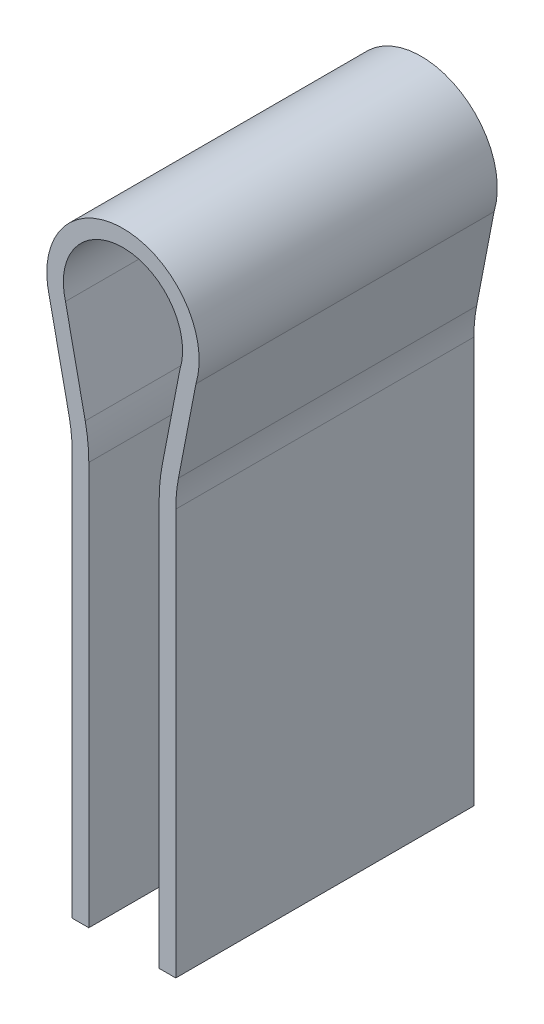
ISO-10303-21;
HEADER;
FILE_DESCRIPTION(('STEP AP214'),'2;1');
FILE_NAME('part.step','',(''),(''),'','','');
FILE_SCHEMA(('AUTOMOTIVE_DESIGN { 1 0 10303 214 1 1 1 1 }'));
ENDSEC;
DATA;
#1=APPLICATION_CONTEXT('core data for automotive mechanical design processes');
#2=APPLICATION_PROTOCOL_DEFINITION('international standard','automotive_design',2000,#1);
#3=PRODUCT_CONTEXT('',#1,'mechanical');
#4=PRODUCT('Part','Part','',(#3));
#5=PRODUCT_RELATED_PRODUCT_CATEGORY('part','',(#4));
#6=PRODUCT_DEFINITION_FORMATION('','',#4);
#7=PRODUCT_DEFINITION_CONTEXT('part definition',#1,'design');
#8=PRODUCT_DEFINITION('design','',#6,#7);
#9=PRODUCT_DEFINITION_SHAPE('','',#8);
#10=(LENGTH_UNIT() NAMED_UNIT(*) SI_UNIT(.MILLI.,.METRE.));
#11=(NAMED_UNIT(*) PLANE_ANGLE_UNIT() SI_UNIT($,.RADIAN.));
#12=(NAMED_UNIT(*) SI_UNIT($,.STERADIAN.) SOLID_ANGLE_UNIT());
#13=UNCERTAINTY_MEASURE_WITH_UNIT(LENGTH_MEASURE(1.E-05),#10,'distance_accuracy_value','');
#14=(GEOMETRIC_REPRESENTATION_CONTEXT(3) GLOBAL_UNCERTAINTY_ASSIGNED_CONTEXT((#13)) GLOBAL_UNIT_ASSIGNED_CONTEXT((#10,
#11,#12)) REPRESENTATION_CONTEXT('',''));
#15=CARTESIAN_POINT('',(0.,0.,0.));
#16=DIRECTION('',(0.,0.,1.));
#17=DIRECTION('',(1.,0.,0.));
#18=AXIS2_PLACEMENT_3D('',#15,#16,#17);
#19=CARTESIAN_POINT('',(4.25,0.,18.));
#20=DIRECTION('',(0.,1.,0.));
#21=DIRECTION('',(0.,0.,1.));
#22=AXIS2_PLACEMENT_3D('',#19,#20,#21);
#23=PLANE('',#22);
#24=DIRECTION('',(1.,0.,0.));
#25=VECTOR('',#24,1.);
#26=CARTESIAN_POINT('',(4.25,0.,0.));
#27=LINE('',#26,#25);
#28=CARTESIAN_POINT('',(4.25,0.,0.));
#29=VERTEX_POINT('',#28);
#30=CARTESIAN_POINT('',(5.25,0.,0.));
#31=VERTEX_POINT('',#30);
#32=EDGE_CURVE('E177',#29,#31,#27,.T.);
#33=ORIENTED_EDGE('',*,*,#32,.T.);
#34=DIRECTION('',(0.,0.,-1.));
#35=VECTOR('',#34,1.);
#36=CARTESIAN_POINT('',(5.25,0.,18.));
#37=LINE('',#36,#35);
#38=CARTESIAN_POINT('',(5.25,0.,18.));
#39=VERTEX_POINT('',#38);
#40=EDGE_CURVE('E11',#39,#31,#37,.T.);
#41=ORIENTED_EDGE('',*,*,#40,.F.);
#42=DIRECTION('',(1.,0.,0.));
#43=VECTOR('',#42,1.);
#44=CARTESIAN_POINT('',(4.25,0.,18.));
#45=LINE('',#44,#43);
#46=CARTESIAN_POINT('',(4.25,0.,18.));
#47=VERTEX_POINT('',#46);
#48=EDGE_CURVE('E215',#47,#39,#45,.T.);
#49=ORIENTED_EDGE('',*,*,#48,.F.);
#50=DIRECTION('',(0.,0.,-1.));
#51=VECTOR('',#50,1.);
#52=CARTESIAN_POINT('',(4.25,0.,18.));
#53=LINE('',#52,#51);
#54=EDGE_CURVE('E49',#47,#29,#53,.T.);
#55=ORIENTED_EDGE('',*,*,#54,.T.);
#56=EDGE_LOOP('',(#33,#41,#49,#55));
#57=FACE_BOUND('',#56,.T.);
#58=ADVANCED_FACE('F33',(#57),#23,.F.);
#59=CARTESIAN_POINT('',(5.25,0.,18.));
#60=DIRECTION('',(-1.,0.,0.));
#61=DIRECTION('',(0.,-1.,0.));
#62=AXIS2_PLACEMENT_3D('',#59,#60,#61);
#63=PLANE('',#62);
#64=DIRECTION('',(0.,1.,0.));
#65=VECTOR('',#64,1.);
#66=CARTESIAN_POINT('',(5.25,0.,0.));
#67=LINE('',#66,#65);
#68=CARTESIAN_POINT('',(5.25,24.5111845914989,0.));
#69=VERTEX_POINT('',#68);
#70=EDGE_CURVE('E179',#31,#69,#67,.T.);
#71=ORIENTED_EDGE('',*,*,#70,.T.);
#72=DIRECTION('',(0.,0.,-1.));
#73=VECTOR('',#72,1.);
#74=CARTESIAN_POINT('',(5.25,24.5111845914989,18.));
#75=LINE('',#74,#73);
#76=CARTESIAN_POINT('',(5.25,24.5111845914989,18.));
#77=VERTEX_POINT('',#76);
#78=EDGE_CURVE('E41',#77,#69,#75,.T.);
#79=ORIENTED_EDGE('',*,*,#78,.F.);
#80=DIRECTION('',(0.,1.,0.));
#81=VECTOR('',#80,1.);
#82=CARTESIAN_POINT('',(5.25,0.,18.));
#83=LINE('',#82,#81);
#84=EDGE_CURVE('E111',#39,#77,#83,.T.);
#85=ORIENTED_EDGE('',*,*,#84,.F.);
#86=ORIENTED_EDGE('',*,*,#40,.T.);
#87=EDGE_LOOP('',(#71,#79,#85,#86));
#88=FACE_BOUND('',#87,.T.);
#89=ADVANCED_FACE('F301',(#88),#63,.F.);
#90=CARTESIAN_POINT('',(14.25,24.5111845914989,18.));
#91=DIRECTION('',(0.,0.,-1.));
#92=DIRECTION('',(-1.,0.,0.));
#93=AXIS2_PLACEMENT_3D('',#90,#91,#92);
#94=CYLINDRICAL_SURFACE('',#93,9.);
#95=CARTESIAN_POINT('',(14.25,24.5111845914989,0.));
#96=DIRECTION('',(0.,0.,-1.));
#97=DIRECTION('',(-1.,0.,0.));
#98=AXIS2_PLACEMENT_3D('',#95,#96,#97);
#99=CIRCLE('',#98,9.);
#100=CARTESIAN_POINT('',(5.41343086698722,26.2185351581622,0.));
#101=VERTEX_POINT('',#100);
#102=EDGE_CURVE('E181',#69,#101,#99,.T.);
#103=ORIENTED_EDGE('',*,*,#102,.T.);
#104=DIRECTION('',(0.,0.,-1.));
#105=VECTOR('',#104,1.);
#106=CARTESIAN_POINT('',(5.41343086698722,26.2185351581622,18.));
#107=LINE('',#106,#105);
#108=CARTESIAN_POINT('',(5.41343086698722,26.2185351581622,18.));
#109=VERTEX_POINT('',#108);
#110=EDGE_CURVE('E241',#109,#101,#107,.T.);
#111=ORIENTED_EDGE('',*,*,#110,.F.);
#112=CARTESIAN_POINT('',(14.25,24.5111845914989,18.));
#113=DIRECTION('',(0.,0.,-1.));
#114=DIRECTION('',(-1.,0.,0.));
#115=AXIS2_PLACEMENT_3D('',#112,#113,#114);
#116=CIRCLE('',#115,9.);
#117=EDGE_CURVE('E249',#77,#109,#116,.T.);
#118=ORIENTED_EDGE('',*,*,#117,.F.);
#119=ORIENTED_EDGE('',*,*,#78,.T.);
#120=EDGE_LOOP('',(#103,#111,#118,#119));
#121=FACE_BOUND('',#120,.T.);
#122=ADVANCED_FACE('F247',(#121),#94,.F.);
#123=CARTESIAN_POINT('',(5.41343086698722,26.2185351581622,18.));
#124=DIRECTION('',(-0.981841014779198,0.18970561851815,0.));
#125=DIRECTION('',(-0.18970561851815,-0.981841014779199,0.));
#126=AXIS2_PLACEMENT_3D('',#123,#124,#125);
#127=PLANE('',#126);
#128=DIRECTION('',(0.18970561851815,0.981841014779198,0.));
#129=VECTOR('',#128,1.);
#130=CARTESIAN_POINT('',(5.41343086698722,26.2185351581622,0.));
#131=LINE('',#130,#129);
#132=CARTESIAN_POINT('',(6.4674462510982,31.6737006003465,0.));
#133=VERTEX_POINT('',#132);
#134=EDGE_CURVE('E183',#101,#133,#131,.T.);
#135=ORIENTED_EDGE('',*,*,#134,.T.);
#136=DIRECTION('',(0.,0.,-1.));
#137=VECTOR('',#136,1.);
#138=CARTESIAN_POINT('',(6.4674462510982,31.6737006003465,18.));
#139=LINE('',#138,#137);
#140=CARTESIAN_POINT('',(6.4674462510982,31.6737006003465,18.));
#141=VERTEX_POINT('',#140);
#142=EDGE_CURVE('E238',#141,#133,#139,.T.);
#143=ORIENTED_EDGE('',*,*,#142,.F.);
#144=DIRECTION('',(0.18970561851815,0.981841014779198,0.));
#145=VECTOR('',#144,1.);
#146=CARTESIAN_POINT('',(5.41343086698722,26.2185351581622,18.));
#147=LINE('',#146,#145);
#148=EDGE_CURVE('E266',#109,#141,#147,.T.);
#149=ORIENTED_EDGE('',*,*,#148,.F.);
#150=ORIENTED_EDGE('',*,*,#110,.T.);
#151=EDGE_LOOP('',(#135,#143,#149,#150));
#152=FACE_BOUND('',#151,.T.);
#153=ADVANCED_FACE('F256',(#152),#127,.F.);
#154=CARTESIAN_POINT('',(2.06276203879621,32.9998819566842,18.));
#155=DIRECTION('',(0.,0.,-1.));
#156=DIRECTION('',(-1.,0.,0.));
#157=AXIS2_PLACEMENT_3D('',#154,#155,#156);
#158=CYLINDRICAL_SURFACE('',#157,4.6);
#159=CARTESIAN_POINT('',(2.06276203879621,32.9998819566842,0.));
#160=DIRECTION('',(0.,0.,1.));
#161=DIRECTION('',(1.,0.,0.));
#162=AXIS2_PLACEMENT_3D('',#159,#160,#161);
#163=CIRCLE('',#162,4.6);
#164=CARTESIAN_POINT('',(-2.37978702323856,31.8066687186525,0.));
#165=VERTEX_POINT('',#164);
#166=EDGE_CURVE('E185',#133,#165,#163,.T.);
#167=ORIENTED_EDGE('',*,*,#166,.T.);
#168=DIRECTION('',(0.,0.,-1.));
#169=VECTOR('',#168,1.);
#170=CARTESIAN_POINT('',(-2.37978702323856,31.8066687186525,18.));
#171=LINE('',#170,#169);
#172=CARTESIAN_POINT('',(-2.37978702323856,31.8066687186525,18.));
#173=VERTEX_POINT('',#172);
#174=EDGE_CURVE('E236',#173,#165,#171,.T.);
#175=ORIENTED_EDGE('',*,*,#174,.F.);
#176=CARTESIAN_POINT('',(2.06276203879621,32.9998819566842,18.));
#177=DIRECTION('',(0.,0.,1.));
#178=DIRECTION('',(1.,0.,0.));
#179=AXIS2_PLACEMENT_3D('',#176,#177,#178);
#180=CIRCLE('',#179,4.6);
#181=EDGE_CURVE('E262',#141,#173,#180,.T.);
#182=ORIENTED_EDGE('',*,*,#181,.F.);
#183=ORIENTED_EDGE('',*,*,#142,.T.);
#184=EDGE_LOOP('',(#167,#175,#182,#183));
#185=FACE_BOUND('',#184,.T.);
#186=ADVANCED_FACE('F260',(#185),#158,.T.);
#187=CARTESIAN_POINT('',(-1.1940246046762,26.1888999245992,18.));
#188=DIRECTION('',(-0.978441710591533,-0.206523168130637,0.));
#189=DIRECTION('',(0.206523168130637,-0.978441710591533,0.));
#190=AXIS2_PLACEMENT_3D('',#187,#188,#189);
#191=PLANE('',#190);
#192=DIRECTION('',(-0.206523168130637,0.978441710591533,0.));
#193=VECTOR('',#192,1.);
#194=CARTESIAN_POINT('',(-1.1940246046762,26.1888999245992,0.));
#195=LINE('',#194,#193);
#196=CARTESIAN_POINT('',(-1.1940246046762,26.1888999245992,0.));
#197=VERTEX_POINT('',#196);
#198=EDGE_CURVE('E188',#197,#165,#195,.T.);
#199=ORIENTED_EDGE('',*,*,#198,.F.);
#200=DIRECTION('',(0.,0.,-1.));
#201=VECTOR('',#200,1.);
#202=CARTESIAN_POINT('',(-1.1940246046762,26.1888999245992,18.));
#203=LINE('',#202,#201);
#204=CARTESIAN_POINT('',(-1.1940246046762,26.1888999245992,18.));
#205=VERTEX_POINT('',#204);
#206=EDGE_CURVE('E234',#205,#197,#203,.T.);
#207=ORIENTED_EDGE('',*,*,#206,.F.);
#208=DIRECTION('',(-0.206523168130637,0.978441710591533,0.));
#209=VECTOR('',#208,1.);
#210=CARTESIAN_POINT('',(-1.1940246046762,26.1888999245992,18.));
#211=LINE('',#210,#209);
#212=EDGE_CURVE('E265',#205,#173,#211,.T.);
#213=ORIENTED_EDGE('',*,*,#212,.T.);
#214=ORIENTED_EDGE('',*,*,#174,.T.);
#215=EDGE_LOOP('',(#199,#207,#213,#214));
#216=FACE_BOUND('',#215,.T.);
#217=ADVANCED_FACE('F317',(#216),#191,.T.);
#218=CARTESIAN_POINT('',(-10.,24.3301914114235,18.));
#219=DIRECTION('',(0.,0.,-1.));
#220=DIRECTION('',(-1.,0.,0.));
#221=AXIS2_PLACEMENT_3D('',#218,#219,#220);
#222=CYLINDRICAL_SURFACE('',#221,9.);
#223=CARTESIAN_POINT('',(-10.,24.3301914114235,0.));
#224=DIRECTION('',(0.,0.,1.));
#225=DIRECTION('',(1.,0.,0.));
#226=AXIS2_PLACEMENT_3D('',#223,#224,#225);
#227=CIRCLE('',#226,9.);
#228=CARTESIAN_POINT('',(-1.,24.3301914114235,0.));
#229=VERTEX_POINT('',#228);
#230=EDGE_CURVE('E191',#229,#197,#227,.T.);
#231=ORIENTED_EDGE('',*,*,#230,.F.);
#232=DIRECTION('',(0.,0.,-1.));
#233=VECTOR('',#232,1.);
#234=CARTESIAN_POINT('',(-1.,24.3301914114235,18.));
#235=LINE('',#234,#233);
#236=CARTESIAN_POINT('',(-1.,24.3301914114235,18.));
#237=VERTEX_POINT('',#236);
#238=EDGE_CURVE('E232',#237,#229,#235,.T.);
#239=ORIENTED_EDGE('',*,*,#238,.F.);
#240=CARTESIAN_POINT('',(-10.,24.3301914114235,18.));
#241=DIRECTION('',(0.,0.,1.));
#242=DIRECTION('',(1.,0.,0.));
#243=AXIS2_PLACEMENT_3D('',#240,#241,#242);
#244=CIRCLE('',#243,9.);
#245=EDGE_CURVE('E268',#237,#205,#244,.T.);
#246=ORIENTED_EDGE('',*,*,#245,.T.);
#247=ORIENTED_EDGE('',*,*,#206,.T.);
#248=EDGE_LOOP('',(#231,#239,#246,#247));
#249=FACE_BOUND('',#248,.T.);
#250=ADVANCED_FACE('F320',(#249),#222,.F.);
#251=CARTESIAN_POINT('',(-1.,0.,18.));
#252=DIRECTION('',(-1.,0.,0.));
#253=DIRECTION('',(0.,0.,1.));
#254=AXIS2_PLACEMENT_3D('',#251,#252,#253);
#255=PLANE('',#254);
#256=DIRECTION('',(0.,1.,0.));
#257=VECTOR('',#256,1.);
#258=CARTESIAN_POINT('',(-1.,0.,0.));
#259=LINE('',#258,#257);
#260=CARTESIAN_POINT('',(-1.,0.,0.));
#261=VERTEX_POINT('',#260);
#262=EDGE_CURVE('E194',#261,#229,#259,.T.);
#263=ORIENTED_EDGE('',*,*,#262,.F.);
#264=DIRECTION('',(0.,0.,-1.));
#265=VECTOR('',#264,1.);
#266=CARTESIAN_POINT('',(-1.,0.,18.));
#267=LINE('',#266,#265);
#268=CARTESIAN_POINT('',(-1.,0.,18.));
#269=VERTEX_POINT('',#268);
#270=EDGE_CURVE('E230',#269,#261,#267,.T.);
#271=ORIENTED_EDGE('',*,*,#270,.F.);
#272=DIRECTION('',(0.,1.,0.));
#273=VECTOR('',#272,1.);
#274=CARTESIAN_POINT('',(-1.,0.,18.));
#275=LINE('',#274,#273);
#276=EDGE_CURVE('E275',#269,#237,#275,.T.);
#277=ORIENTED_EDGE('',*,*,#276,.T.);
#278=ORIENTED_EDGE('',*,*,#238,.T.);
#279=EDGE_LOOP('',(#263,#271,#277,#278));
#280=FACE_BOUND('',#279,.T.);
#281=ADVANCED_FACE('F324',(#280),#255,.T.);
#282=CARTESIAN_POINT('',(-1.,0.,18.));
#283=DIRECTION('',(0.,1.,0.));
#284=DIRECTION('',(0.,0.,1.));
#285=AXIS2_PLACEMENT_3D('',#282,#283,#284);
#286=PLANE('',#285);
#287=DIRECTION('',(1.,0.,0.));
#288=VECTOR('',#287,1.);
#289=CARTESIAN_POINT('',(-1.,0.,0.));
#290=LINE('',#289,#288);
#291=CARTESIAN_POINT('',(0.,0.,0.));
#292=VERTEX_POINT('',#291);
#293=EDGE_CURVE('E197',#261,#292,#290,.T.);
#294=ORIENTED_EDGE('',*,*,#293,.T.);
#295=DIRECTION('',(0.,0.,-1.));
#296=VECTOR('',#295,1.);
#297=CARTESIAN_POINT('',(0.,0.,18.));
#298=LINE('',#297,#296);
#299=CARTESIAN_POINT('',(0.,0.,18.));
#300=VERTEX_POINT('',#299);
#301=EDGE_CURVE('E227',#300,#292,#298,.T.);
#302=ORIENTED_EDGE('',*,*,#301,.F.);
#303=DIRECTION('',(1.,0.,0.));
#304=VECTOR('',#303,1.);
#305=CARTESIAN_POINT('',(-1.,0.,18.));
#306=LINE('',#305,#304);
#307=EDGE_CURVE('E278',#269,#300,#306,.T.);
#308=ORIENTED_EDGE('',*,*,#307,.F.);
#309=ORIENTED_EDGE('',*,*,#270,.T.);
#310=EDGE_LOOP('',(#294,#302,#308,#309));
#311=FACE_BOUND('',#310,.T.);
#312=ADVANCED_FACE('F328',(#311),#286,.F.);
#313=CARTESIAN_POINT('',(0.,0.,18.));
#314=DIRECTION('',(-1.,0.,0.));
#315=DIRECTION('',(0.,0.,1.));
#316=AXIS2_PLACEMENT_3D('',#313,#314,#315);
#317=PLANE('',#316);
#318=DIRECTION('',(0.,1.,0.));
#319=VECTOR('',#318,1.);
#320=CARTESIAN_POINT('',(0.,0.,0.));
#321=LINE('',#320,#319);
#322=CARTESIAN_POINT('',(0.,24.3301914114235,0.));
#323=VERTEX_POINT('',#322);
#324=EDGE_CURVE('E199',#292,#323,#321,.T.);
#325=ORIENTED_EDGE('',*,*,#324,.T.);
#326=DIRECTION('',(0.,0.,-1.));
#327=VECTOR('',#326,1.);
#328=CARTESIAN_POINT('',(0.,24.3301914114235,18.));
#329=LINE('',#328,#327);
#330=CARTESIAN_POINT('',(0.,24.3301914114235,18.));
#331=VERTEX_POINT('',#330);
#332=EDGE_CURVE('E224',#331,#323,#329,.T.);
#333=ORIENTED_EDGE('',*,*,#332,.F.);
#334=DIRECTION('',(0.,1.,0.));
#335=VECTOR('',#334,1.);
#336=CARTESIAN_POINT('',(0.,0.,18.));
#337=LINE('',#336,#335);
#338=EDGE_CURVE('E280',#300,#331,#337,.T.);
#339=ORIENTED_EDGE('',*,*,#338,.F.);
#340=ORIENTED_EDGE('',*,*,#301,.T.);
#341=EDGE_LOOP('',(#325,#333,#339,#340));
#342=FACE_BOUND('',#341,.T.);
#343=ADVANCED_FACE('F332',(#342),#317,.F.);
#344=CARTESIAN_POINT('',(-10.,24.3301914114235,18.));
#345=DIRECTION('',(0.,0.,-1.));
#346=DIRECTION('',(-1.,0.,0.));
#347=AXIS2_PLACEMENT_3D('',#344,#345,#346);
#348=CYLINDRICAL_SURFACE('',#347,10.);
#349=CARTESIAN_POINT('',(-10.,24.3301914114235,0.));
#350=DIRECTION('',(0.,0.,1.));
#351=DIRECTION('',(1.,0.,0.));
#352=AXIS2_PLACEMENT_3D('',#349,#350,#351);
#353=CIRCLE('',#352,10.);
#354=CARTESIAN_POINT('',(-0.215582894084672,26.3954230927299,0.));
#355=VERTEX_POINT('',#354);
#356=EDGE_CURVE('E201',#323,#355,#353,.T.);
#357=ORIENTED_EDGE('',*,*,#356,.T.);
#358=DIRECTION('',(0.,0.,-1.));
#359=VECTOR('',#358,1.);
#360=CARTESIAN_POINT('',(-0.215582894084672,26.3954230927299,18.));
#361=LINE('',#360,#359);
#362=CARTESIAN_POINT('',(-0.215582894084672,26.3954230927299,18.));
#363=VERTEX_POINT('',#362);
#364=EDGE_CURVE('E221',#363,#355,#361,.T.);
#365=ORIENTED_EDGE('',*,*,#364,.F.);
#366=CARTESIAN_POINT('',(-10.,24.3301914114235,18.));
#367=DIRECTION('',(0.,0.,1.));
#368=DIRECTION('',(1.,0.,0.));
#369=AXIS2_PLACEMENT_3D('',#366,#367,#368);
#370=CIRCLE('',#369,10.);
#371=EDGE_CURVE('E282',#331,#363,#370,.T.);
#372=ORIENTED_EDGE('',*,*,#371,.F.);
#373=ORIENTED_EDGE('',*,*,#332,.T.);
#374=EDGE_LOOP('',(#357,#365,#372,#373));
#375=FACE_BOUND('',#374,.T.);
#376=ADVANCED_FACE('F336',(#375),#348,.T.);
#377=CARTESIAN_POINT('',(-0.215582894084672,26.3954230927299,18.));
#378=DIRECTION('',(-0.978441710591533,-0.206523168130636,0.));
#379=DIRECTION('',(0.206523168130636,-0.978441710591533,0.));
#380=AXIS2_PLACEMENT_3D('',#377,#378,#379);
#381=PLANE('',#380);
#382=DIRECTION('',(-0.206523168130636,0.978441710591533,0.));
#383=VECTOR('',#382,1.);
#384=CARTESIAN_POINT('',(-0.215582894084672,26.3954230927299,0.));
#385=LINE('',#384,#383);
#386=CARTESIAN_POINT('',(-1.40730553343082,32.0414295352368,0.));
#387=VERTEX_POINT('',#386);
#388=EDGE_CURVE('E203',#355,#387,#385,.T.);
#389=ORIENTED_EDGE('',*,*,#388,.T.);
#390=DIRECTION('',(0.,0.,-1.));
#391=VECTOR('',#390,1.);
#392=CARTESIAN_POINT('',(-1.40730553343082,32.0414295352368,18.));
#393=LINE('',#392,#391);
#394=CARTESIAN_POINT('',(-1.40730553343082,32.0414295352368,18.));
#395=VERTEX_POINT('',#394);
#396=EDGE_CURVE('E219',#395,#387,#393,.T.);
#397=ORIENTED_EDGE('',*,*,#396,.F.);
#398=DIRECTION('',(-0.206523168130636,0.978441710591533,0.));
#399=VECTOR('',#398,1.);
#400=CARTESIAN_POINT('',(-0.215582894084672,26.3954230927299,18.));
#401=LINE('',#400,#399);
#402=EDGE_CURVE('E284',#363,#395,#401,.T.);
#403=ORIENTED_EDGE('',*,*,#402,.F.);
#404=ORIENTED_EDGE('',*,*,#364,.T.);
#405=EDGE_LOOP('',(#389,#397,#403,#404));
#406=FACE_BOUND('',#405,.T.);
#407=ADVANCED_FACE('F340',(#406),#381,.F.);
#408=CARTESIAN_POINT('',(2.06276203879621,32.9998819566842,18.));
#409=DIRECTION('',(0.,0.,-1.));
#410=DIRECTION('',(-1.,0.,0.));
#411=AXIS2_PLACEMENT_3D('',#408,#409,#410);
#412=CYLINDRICAL_SURFACE('',#411,3.6);
#413=CARTESIAN_POINT('',(2.06276203879621,32.9998819566842,0.));
#414=DIRECTION('',(0.,0.,1.));
#415=DIRECTION('',(1.,0.,0.));
#416=AXIS2_PLACEMENT_3D('',#413,#414,#415);
#417=CIRCLE('',#416,3.6);
#418=CARTESIAN_POINT('',(5.49584152656892,31.916385195898,0.));
#419=VERTEX_POINT('',#418);
#420=EDGE_CURVE('E206',#419,#387,#417,.T.);
#421=ORIENTED_EDGE('',*,*,#420,.F.);
#422=DIRECTION('',(0.,0.,-1.));
#423=VECTOR('',#422,1.);
#424=CARTESIAN_POINT('',(5.49584152656892,31.916385195898,18.));
#425=LINE('',#424,#423);
#426=CARTESIAN_POINT('',(5.49584152656892,31.916385195898,18.));
#427=VERTEX_POINT('',#426);
#428=EDGE_CURVE('E160',#427,#419,#425,.T.);
#429=ORIENTED_EDGE('',*,*,#428,.F.);
#430=CARTESIAN_POINT('',(2.06276203879621,32.9998819566842,18.));
#431=DIRECTION('',(0.,0.,1.));
#432=DIRECTION('',(1.,0.,0.));
#433=AXIS2_PLACEMENT_3D('',#430,#431,#432);
#434=CIRCLE('',#433,3.6);
#435=EDGE_CURVE('E169',#427,#395,#434,.T.);
#436=ORIENTED_EDGE('',*,*,#435,.T.);
#437=ORIENTED_EDGE('',*,*,#396,.T.);
#438=EDGE_LOOP('',(#421,#429,#436,#437));
#439=FACE_BOUND('',#438,.T.);
#440=ADVANCED_FACE('F287',(#439),#412,.F.);
#441=CARTESIAN_POINT('',(4.43158985220802,26.4082407766804,18.));
#442=DIRECTION('',(-0.981841014779198,0.189705618518149,0.));
#443=DIRECTION('',(-0.189705618518149,-0.981841014779199,0.));
#444=AXIS2_PLACEMENT_3D('',#441,#442,#443);
#445=PLANE('',#444);
#446=DIRECTION('',(0.189705618518149,0.981841014779198,0.));
#447=VECTOR('',#446,1.);
#448=CARTESIAN_POINT('',(4.43158985220802,26.4082407766804,0.));
#449=LINE('',#448,#447);
#450=CARTESIAN_POINT('',(4.43158985220802,26.4082407766804,0.));
#451=VERTEX_POINT('',#450);
#452=EDGE_CURVE('E156',#451,#419,#449,.T.);
#453=ORIENTED_EDGE('',*,*,#452,.F.);
#454=DIRECTION('',(0.,0.,-1.));
#455=VECTOR('',#454,1.);
#456=CARTESIAN_POINT('',(4.43158985220802,26.4082407766804,18.));
#457=LINE('',#456,#455);
#458=CARTESIAN_POINT('',(4.43158985220802,26.4082407766804,18.));
#459=VERTEX_POINT('',#458);
#460=EDGE_CURVE('E151',#459,#451,#457,.T.);
#461=ORIENTED_EDGE('',*,*,#460,.F.);
#462=DIRECTION('',(0.189705618518149,0.981841014779198,0.));
#463=VECTOR('',#462,1.);
#464=CARTESIAN_POINT('',(4.43158985220802,26.4082407766804,18.));
#465=LINE('',#464,#463);
#466=EDGE_CURVE('E154',#459,#427,#465,.T.);
#467=ORIENTED_EDGE('',*,*,#466,.T.);
#468=ORIENTED_EDGE('',*,*,#428,.T.);
#469=EDGE_LOOP('',(#453,#461,#467,#468));
#470=FACE_BOUND('',#469,.T.);
#471=ADVANCED_FACE('F153',(#470),#445,.T.);
#472=CARTESIAN_POINT('',(14.25,24.5111845914989,18.));
#473=DIRECTION('',(0.,0.,-1.));
#474=DIRECTION('',(-1.,0.,0.));
#475=AXIS2_PLACEMENT_3D('',#472,#473,#474);
#476=CYLINDRICAL_SURFACE('',#475,10.);
#477=CARTESIAN_POINT('',(14.25,24.5111845914989,0.));
#478=DIRECTION('',(0.,0.,-1.));
#479=DIRECTION('',(-1.,0.,0.));
#480=AXIS2_PLACEMENT_3D('',#477,#478,#479);
#481=CIRCLE('',#480,10.);
#482=CARTESIAN_POINT('',(4.25,24.5111845914989,0.));
#483=VERTEX_POINT('',#482);
#484=EDGE_CURVE('E210',#483,#451,#481,.T.);
#485=ORIENTED_EDGE('',*,*,#484,.F.);
#486=DIRECTION('',(0.,0.,-1.));
#487=VECTOR('',#486,1.);
#488=CARTESIAN_POINT('',(4.25,24.5111845914989,18.));
#489=LINE('',#488,#487);
#490=CARTESIAN_POINT('',(4.25,24.5111845914989,18.));
#491=VERTEX_POINT('',#490);
#492=EDGE_CURVE('E99',#491,#483,#489,.T.);
#493=ORIENTED_EDGE('',*,*,#492,.F.);
#494=CARTESIAN_POINT('',(14.25,24.5111845914989,18.));
#495=DIRECTION('',(0.,0.,-1.));
#496=DIRECTION('',(-1.,0.,0.));
#497=AXIS2_PLACEMENT_3D('',#494,#495,#496);
#498=CIRCLE('',#497,10.);
#499=EDGE_CURVE('E167',#491,#459,#498,.T.);
#500=ORIENTED_EDGE('',*,*,#499,.T.);
#501=ORIENTED_EDGE('',*,*,#460,.T.);
#502=EDGE_LOOP('',(#485,#493,#500,#501));
#503=FACE_BOUND('',#502,.T.);
#504=ADVANCED_FACE('F171',(#503),#476,.T.);
#505=CARTESIAN_POINT('',(4.25,0.,18.));
#506=DIRECTION('',(-1.,0.,0.));
#507=DIRECTION('',(0.,0.,1.));
#508=AXIS2_PLACEMENT_3D('',#505,#506,#507);
#509=PLANE('',#508);
#510=DIRECTION('',(0.,1.,0.));
#511=VECTOR('',#510,1.);
#512=CARTESIAN_POINT('',(4.25,0.,0.));
#513=LINE('',#512,#511);
#514=EDGE_CURVE('E212',#29,#483,#513,.T.);
#515=ORIENTED_EDGE('',*,*,#514,.F.);
#516=ORIENTED_EDGE('',*,*,#54,.F.);
#517=DIRECTION('',(0.,1.,0.));
#518=VECTOR('',#517,1.);
#519=CARTESIAN_POINT('',(4.25,0.,18.));
#520=LINE('',#519,#518);
#521=EDGE_CURVE('E172',#47,#491,#520,.T.);
#522=ORIENTED_EDGE('',*,*,#521,.T.);
#523=ORIENTED_EDGE('',*,*,#492,.T.);
#524=EDGE_LOOP('',(#515,#516,#522,#523));
#525=FACE_BOUND('',#524,.T.);
#526=ADVANCED_FACE('F290',(#525),#509,.T.);
#527=CARTESIAN_POINT('',(14.25,24.5111845914989,18.));
#528=DIRECTION('',(0.,0.,-1.));
#529=DIRECTION('',(-1.,0.,0.));
#530=AXIS2_PLACEMENT_3D('',#527,#528,#529);
#531=PLANE('',#530);
#532=ORIENTED_EDGE('',*,*,#48,.T.);
#533=ORIENTED_EDGE('',*,*,#84,.T.);
#534=ORIENTED_EDGE('',*,*,#117,.T.);
#535=ORIENTED_EDGE('',*,*,#148,.T.);
#536=ORIENTED_EDGE('',*,*,#181,.T.);
#537=ORIENTED_EDGE('',*,*,#212,.F.);
#538=ORIENTED_EDGE('',*,*,#245,.F.);
#539=ORIENTED_EDGE('',*,*,#276,.F.);
#540=ORIENTED_EDGE('',*,*,#307,.T.);
#541=ORIENTED_EDGE('',*,*,#338,.T.);
#542=ORIENTED_EDGE('',*,*,#371,.T.);
#543=ORIENTED_EDGE('',*,*,#402,.T.);
#544=ORIENTED_EDGE('',*,*,#435,.F.);
#545=ORIENTED_EDGE('',*,*,#466,.F.);
#546=ORIENTED_EDGE('',*,*,#499,.F.);
#547=ORIENTED_EDGE('',*,*,#521,.F.);
#548=EDGE_LOOP('',(#532,#533,#534,#535,#536,#537,#538,#539,#540,#541,#542,#543,#544,#545,#546,#547));
#549=FACE_BOUND('',#548,.T.);
#550=ADVANCED_FACE('F165',(#549),#531,.F.);
#551=CARTESIAN_POINT('',(14.25,24.5111845914989,0.));
#552=DIRECTION('',(0.,0.,-1.));
#553=DIRECTION('',(-1.,0.,0.));
#554=AXIS2_PLACEMENT_3D('',#551,#552,#553);
#555=PLANE('',#554);
#556=ORIENTED_EDGE('',*,*,#32,.F.);
#557=ORIENTED_EDGE('',*,*,#514,.T.);
#558=ORIENTED_EDGE('',*,*,#484,.T.);
#559=ORIENTED_EDGE('',*,*,#452,.T.);
#560=ORIENTED_EDGE('',*,*,#420,.T.);
#561=ORIENTED_EDGE('',*,*,#388,.F.);
#562=ORIENTED_EDGE('',*,*,#356,.F.);
#563=ORIENTED_EDGE('',*,*,#324,.F.);
#564=ORIENTED_EDGE('',*,*,#293,.F.);
#565=ORIENTED_EDGE('',*,*,#262,.T.);
#566=ORIENTED_EDGE('',*,*,#230,.T.);
#567=ORIENTED_EDGE('',*,*,#198,.T.);
#568=ORIENTED_EDGE('',*,*,#166,.F.);
#569=ORIENTED_EDGE('',*,*,#134,.F.);
#570=ORIENTED_EDGE('',*,*,#102,.F.);
#571=ORIENTED_EDGE('',*,*,#70,.F.);
#572=EDGE_LOOP('',(#556,#557,#558,#559,#560,#561,#562,#563,#564,#565,#566,#567,#568,#569,#570,#571));
#573=FACE_BOUND('',#572,.T.);
#574=ADVANCED_FACE('F252',(#573),#555,.T.);
#575=CLOSED_SHELL('',(#58,#89,#122,#153,#186,#217,#250,#281,#312,#343,#376,#407,#440,#471,#504,
#526,#550,#574));
#576=MANIFOLD_SOLID_BREP('B2',#575);
#577=ADVANCED_BREP_SHAPE_REPRESENTATION('',(#18,#576),#14);
#578=SHAPE_DEFINITION_REPRESENTATION(#9,#577);
ENDSEC;
END-ISO-10303-21;
